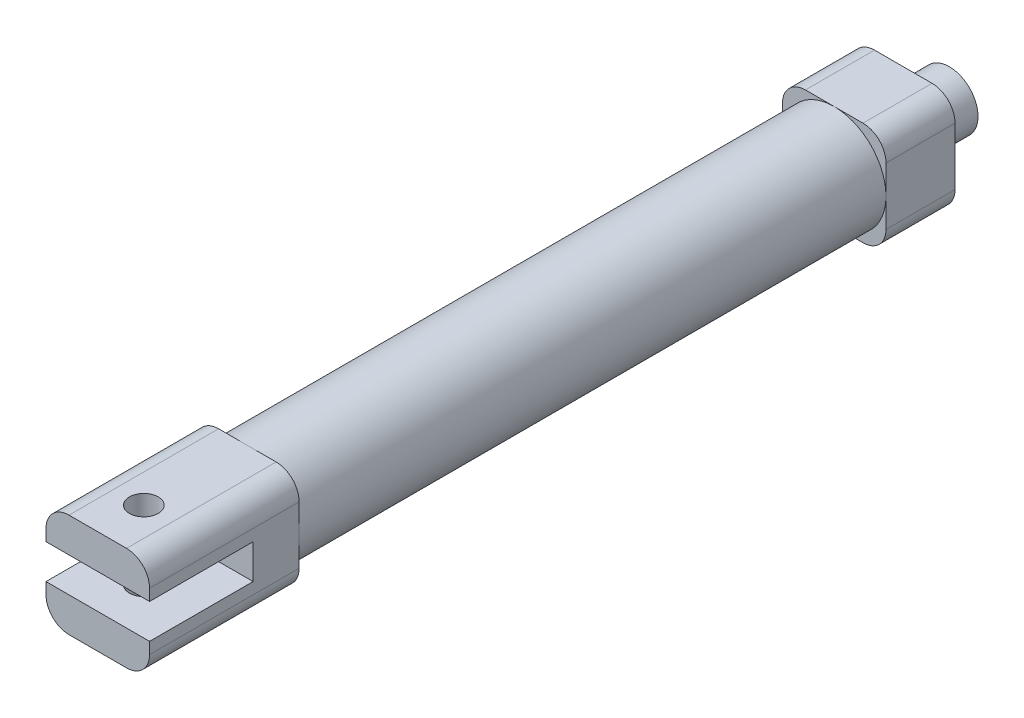
ISO-10303-21;
HEADER;
FILE_DESCRIPTION(('STEP AP214'),'2;1');
FILE_NAME('part.step','',(''),(''),'','','');
FILE_SCHEMA(('AUTOMOTIVE_DESIGN { 1 0 10303 214 1 1 1 1 }'));
ENDSEC;
DATA;
#1=APPLICATION_CONTEXT('core data for automotive mechanical design processes');
#2=APPLICATION_PROTOCOL_DEFINITION('international standard','automotive_design',2000,#1);
#3=PRODUCT_CONTEXT('',#1,'mechanical');
#4=PRODUCT('Part','Part','',(#3));
#5=PRODUCT_RELATED_PRODUCT_CATEGORY('part','',(#4));
#6=PRODUCT_DEFINITION_FORMATION('','',#4);
#7=PRODUCT_DEFINITION_CONTEXT('part definition',#1,'design');
#8=PRODUCT_DEFINITION('design','',#6,#7);
#9=PRODUCT_DEFINITION_SHAPE('','',#8);
#10=(LENGTH_UNIT() NAMED_UNIT(*) SI_UNIT(.MILLI.,.METRE.));
#11=(NAMED_UNIT(*) PLANE_ANGLE_UNIT() SI_UNIT($,.RADIAN.));
#12=(NAMED_UNIT(*) SI_UNIT($,.STERADIAN.) SOLID_ANGLE_UNIT());
#13=UNCERTAINTY_MEASURE_WITH_UNIT(LENGTH_MEASURE(1.E-05),#10,'distance_accuracy_value','');
#14=(GEOMETRIC_REPRESENTATION_CONTEXT(3) GLOBAL_UNCERTAINTY_ASSIGNED_CONTEXT((#13)) GLOBAL_UNIT_ASSIGNED_CONTEXT((#10,
#11,#12)) REPRESENTATION_CONTEXT('',''));
#15=CARTESIAN_POINT('',(0.,0.,0.));
#16=DIRECTION('',(0.,0.,1.));
#17=DIRECTION('',(1.,0.,0.));
#18=AXIS2_PLACEMENT_3D('',#15,#16,#17);
#19=CARTESIAN_POINT('',(-5.,5.,128.));
#20=DIRECTION('',(0.,0.,1.));
#21=DIRECTION('',(1.,0.,0.));
#22=AXIS2_PLACEMENT_3D('',#19,#20,#21);
#23=PLANE('',#22);
#24=DIRECTION('',(1.,0.,0.));
#25=VECTOR('',#24,1.);
#26=CARTESIAN_POINT('',(-5.,-3.,128.));
#27=LINE('',#26,#25);
#28=CARTESIAN_POINT('',(-9.,-3.,128.));
#29=VERTEX_POINT('',#28);
#30=CARTESIAN_POINT('',(9.,-3.,128.));
#31=VERTEX_POINT('',#30);
#32=EDGE_CURVE('E43',#29,#31,#27,.T.);
#33=ORIENTED_EDGE('',*,*,#32,.F.);
#34=DIRECTION('',(0.,-1.,0.));
#35=VECTOR('',#34,1.);
#36=CARTESIAN_POINT('',(-9.,-5.,128.));
#37=LINE('',#36,#35);
#38=CARTESIAN_POINT('',(-9.,-5.,128.));
#39=VERTEX_POINT('',#38);
#40=EDGE_CURVE('E222',#29,#39,#37,.T.);
#41=ORIENTED_EDGE('',*,*,#40,.T.);
#42=CARTESIAN_POINT('',(-5.,-5.,128.));
#43=DIRECTION('',(0.,0.,1.));
#44=DIRECTION('',(1.,0.,0.));
#45=AXIS2_PLACEMENT_3D('',#42,#43,#44);
#46=CIRCLE('',#45,4.);
#47=CARTESIAN_POINT('',(-5.,-9.,128.));
#48=VERTEX_POINT('',#47);
#49=EDGE_CURVE('E221',#39,#48,#46,.T.);
#50=ORIENTED_EDGE('',*,*,#49,.T.);
#51=DIRECTION('',(1.,0.,0.));
#52=VECTOR('',#51,1.);
#53=CARTESIAN_POINT('',(-5.,-9.,128.));
#54=LINE('',#53,#52);
#55=CARTESIAN_POINT('',(5.,-9.,128.));
#56=VERTEX_POINT('',#55);
#57=EDGE_CURVE('E224',#48,#56,#54,.T.);
#58=ORIENTED_EDGE('',*,*,#57,.T.);
#59=CARTESIAN_POINT('',(5.,-5.,128.));
#60=DIRECTION('',(0.,0.,1.));
#61=DIRECTION('',(-1.,0.,0.));
#62=AXIS2_PLACEMENT_3D('',#59,#60,#61);
#63=CIRCLE('',#62,4.);
#64=CARTESIAN_POINT('',(9.,-5.,128.));
#65=VERTEX_POINT('',#64);
#66=EDGE_CURVE('E230',#56,#65,#63,.T.);
#67=ORIENTED_EDGE('',*,*,#66,.T.);
#68=DIRECTION('',(0.,1.,0.));
#69=VECTOR('',#68,1.);
#70=CARTESIAN_POINT('',(9.,-5.,128.));
#71=LINE('',#70,#69);
#72=EDGE_CURVE('E233',#65,#31,#71,.T.);
#73=ORIENTED_EDGE('',*,*,#72,.T.);
#74=EDGE_LOOP('',(#33,#41,#50,#58,#67,#73));
#75=FACE_BOUND('',#74,.T.);
#76=ADVANCED_FACE('F34',(#75),#23,.T.);
#77=CARTESIAN_POINT('',(4.99999999999999,-5.,0.));
#78=DIRECTION('',(0.,0.,-1.));
#79=DIRECTION('',(-1.,0.,0.));
#80=AXIS2_PLACEMENT_3D('',#77,#78,#79);
#81=PLANE('',#80);
#82=CARTESIAN_POINT('',(0.,0.,0.));
#83=DIRECTION('',(0.,0.,-1.));
#84=DIRECTION('',(-1.,0.,0.));
#85=AXIS2_PLACEMENT_3D('',#82,#83,#84);
#86=CIRCLE('',#85,2.5);
#87=CARTESIAN_POINT('',(-2.5,0.,0.));
#88=VERTEX_POINT('',#87);
#89=EDGE_CURVE('E304',#88,#88,#86,.T.);
#90=ORIENTED_EDGE('',*,*,#89,.T.);
#91=EDGE_LOOP('',(#90));
#92=FACE_BOUND('',#91,.T.);
#93=CARTESIAN_POINT('',(0.,0.,0.));
#94=DIRECTION('',(0.,0.,1.));
#95=DIRECTION('',(1.,0.,0.));
#96=AXIS2_PLACEMENT_3D('',#93,#94,#95);
#97=CIRCLE('',#96,8.);
#98=CARTESIAN_POINT('',(8.,0.,0.));
#99=VERTEX_POINT('',#98);
#100=EDGE_CURVE('E292',#99,#99,#97,.T.);
#101=ORIENTED_EDGE('',*,*,#100,.T.);
#102=EDGE_LOOP('',(#101));
#103=FACE_BOUND('',#102,.T.);
#104=ADVANCED_FACE('F479',(#92,#103),#81,.F.);
#105=CARTESIAN_POINT('',(-5.,5.,102.));
#106=DIRECTION('',(0.,0.,1.));
#107=DIRECTION('',(1.,0.,0.));
#108=AXIS2_PLACEMENT_3D('',#105,#106,#107);
#109=PLANE('',#108);
#110=CARTESIAN_POINT('',(0.,0.,102.));
#111=DIRECTION('',(0.,0.,1.));
#112=DIRECTION('',(1.,0.,0.));
#113=AXIS2_PLACEMENT_3D('',#110,#111,#112);
#114=CIRCLE('',#113,8.);
#115=CARTESIAN_POINT('',(8.,0.,102.));
#116=VERTEX_POINT('',#115);
#117=EDGE_CURVE('E289',#116,#116,#114,.T.);
#118=ORIENTED_EDGE('',*,*,#117,.F.);
#119=EDGE_LOOP('',(#118));
#120=FACE_BOUND('',#119,.T.);
#121=ADVANCED_FACE('F488',(#120),#109,.F.);
#122=CARTESIAN_POINT('',(0.,0.,102.));
#123=DIRECTION('',(0.,0.,-1.));
#124=DIRECTION('',(-1.,0.,0.));
#125=AXIS2_PLACEMENT_3D('',#122,#123,#124);
#126=CYLINDRICAL_SURFACE('',#125,8.);
#127=ORIENTED_EDGE('',*,*,#117,.T.);
#128=EDGE_LOOP('',(#127));
#129=FACE_BOUND('',#128,.T.);
#130=ORIENTED_EDGE('',*,*,#100,.F.);
#131=EDGE_LOOP('',(#130));
#132=FACE_BOUND('',#131,.T.);
#133=ADVANCED_FACE('F527',(#129,#132),#126,.F.);
#134=CARTESIAN_POINT('',(0.,0.,18.));
#135=DIRECTION('',(0.,0.,-1.));
#136=DIRECTION('',(-1.,0.,0.));
#137=AXIS2_PLACEMENT_3D('',#134,#135,#136);
#138=CYLINDRICAL_SURFACE('',#137,2.5);
#139=CARTESIAN_POINT('',(0.,0.,-20.));
#140=DIRECTION('',(0.,0.,-1.));
#141=DIRECTION('',(-1.,0.,0.));
#142=AXIS2_PLACEMENT_3D('',#139,#140,#141);
#143=CIRCLE('',#142,2.5);
#144=CARTESIAN_POINT('',(-2.5,0.,-20.));
#145=VERTEX_POINT('',#144);
#146=EDGE_CURVE('E307',#145,#145,#143,.T.);
#147=ORIENTED_EDGE('',*,*,#146,.T.);
#148=EDGE_LOOP('',(#147));
#149=FACE_BOUND('',#148,.T.);
#150=ORIENTED_EDGE('',*,*,#89,.F.);
#151=EDGE_LOOP('',(#150));
#152=FACE_BOUND('',#151,.T.);
#153=ADVANCED_FACE('F529',(#149,#152),#138,.F.);
#154=CARTESIAN_POINT('',(4.99999999999999,-5.,-12.));
#155=DIRECTION('',(0.,0.,-1.));
#156=DIRECTION('',(-1.,0.,0.));
#157=AXIS2_PLACEMENT_3D('',#154,#155,#156);
#158=PLANE('',#157);
#159=CARTESIAN_POINT('',(4.99999999999999,-5.,-12.));
#160=DIRECTION('',(0.,0.,-1.));
#161=DIRECTION('',(-1.,0.,0.));
#162=AXIS2_PLACEMENT_3D('',#159,#160,#161);
#163=CIRCLE('',#162,4.);
#164=CARTESIAN_POINT('',(8.99999999999999,-5.,-12.));
#165=VERTEX_POINT('',#164);
#166=CARTESIAN_POINT('',(4.99999999999999,-9.,-12.));
#167=VERTEX_POINT('',#166);
#168=EDGE_CURVE('E375',#165,#167,#163,.T.);
#169=ORIENTED_EDGE('',*,*,#168,.T.);
#170=DIRECTION('',(-1.,0.,0.));
#171=VECTOR('',#170,1.);
#172=CARTESIAN_POINT('',(4.99999999999999,-9.,-12.));
#173=LINE('',#172,#171);
#174=CARTESIAN_POINT('',(-5.00000000000001,-9.,-12.));
#175=VERTEX_POINT('',#174);
#176=EDGE_CURVE('E378',#167,#175,#173,.T.);
#177=ORIENTED_EDGE('',*,*,#176,.T.);
#178=CARTESIAN_POINT('',(-5.00000000000001,-5.,-12.));
#179=DIRECTION('',(0.,0.,-1.));
#180=DIRECTION('',(-1.,0.,0.));
#181=AXIS2_PLACEMENT_3D('',#178,#179,#180);
#182=CIRCLE('',#181,4.);
#183=CARTESIAN_POINT('',(-9.00000000000001,-5.,-12.));
#184=VERTEX_POINT('',#183);
#185=EDGE_CURVE('E380',#175,#184,#182,.T.);
#186=ORIENTED_EDGE('',*,*,#185,.T.);
#187=DIRECTION('',(0.,1.,0.));
#188=VECTOR('',#187,1.);
#189=CARTESIAN_POINT('',(-9.00000000000001,-5.,-12.));
#190=LINE('',#189,#188);
#191=CARTESIAN_POINT('',(-9.00000000000001,5.,-12.));
#192=VERTEX_POINT('',#191);
#193=EDGE_CURVE('E382',#184,#192,#190,.T.);
#194=ORIENTED_EDGE('',*,*,#193,.T.);
#195=CARTESIAN_POINT('',(-5.00000000000001,5.,-12.));
#196=DIRECTION('',(0.,0.,-1.));
#197=DIRECTION('',(-1.,0.,0.));
#198=AXIS2_PLACEMENT_3D('',#195,#196,#197);
#199=CIRCLE('',#198,4.);
#200=CARTESIAN_POINT('',(-5.00000000000001,9.,-12.));
#201=VERTEX_POINT('',#200);
#202=EDGE_CURVE('E384',#192,#201,#199,.T.);
#203=ORIENTED_EDGE('',*,*,#202,.T.);
#204=DIRECTION('',(1.,0.,0.));
#205=VECTOR('',#204,1.);
#206=CARTESIAN_POINT('',(4.99999999999999,9.,-12.));
#207=LINE('',#206,#205);
#208=CARTESIAN_POINT('',(4.99999999999999,9.,-12.));
#209=VERTEX_POINT('',#208);
#210=EDGE_CURVE('E386',#201,#209,#207,.T.);
#211=ORIENTED_EDGE('',*,*,#210,.T.);
#212=CARTESIAN_POINT('',(4.99999999999999,5.,-12.));
#213=DIRECTION('',(0.,0.,-1.));
#214=DIRECTION('',(-1.,0.,0.));
#215=AXIS2_PLACEMENT_3D('',#212,#213,#214);
#216=CIRCLE('',#215,4.);
#217=CARTESIAN_POINT('',(8.99999999999999,5.,-12.));
#218=VERTEX_POINT('',#217);
#219=EDGE_CURVE('E388',#209,#218,#216,.T.);
#220=ORIENTED_EDGE('',*,*,#219,.T.);
#221=DIRECTION('',(0.,-1.,0.));
#222=VECTOR('',#221,1.);
#223=CARTESIAN_POINT('',(8.99999999999999,-5.,-12.));
#224=LINE('',#223,#222);
#225=EDGE_CURVE('E390',#218,#165,#224,.T.);
#226=ORIENTED_EDGE('',*,*,#225,.T.);
#227=EDGE_LOOP('',(#169,#177,#186,#194,#203,#211,#220,#226));
#228=FACE_BOUND('',#227,.T.);
#229=CARTESIAN_POINT('',(0.,0.,-12.));
#230=DIRECTION('',(0.,0.,-1.));
#231=DIRECTION('',(-1.,0.,0.));
#232=AXIS2_PLACEMENT_3D('',#229,#230,#231);
#233=CIRCLE('',#232,5.);
#234=CARTESIAN_POINT('',(-5.,0.,-12.));
#235=VERTEX_POINT('',#234);
#236=EDGE_CURVE('E306',#235,#235,#233,.T.);
#237=ORIENTED_EDGE('',*,*,#236,.F.);
#238=EDGE_LOOP('',(#237));
#239=FACE_BOUND('',#238,.T.);
#240=ADVANCED_FACE('F462',(#228,#239),#158,.T.);
#241=CARTESIAN_POINT('',(0.,0.,102.));
#242=DIRECTION('',(0.,0.,-1.));
#243=DIRECTION('',(-1.,0.,0.));
#244=AXIS2_PLACEMENT_3D('',#241,#242,#243);
#245=CYLINDRICAL_SURFACE('',#244,9.);
#246=CARTESIAN_POINT('',(0.,0.,102.));
#247=DIRECTION('',(0.,0.,1.));
#248=DIRECTION('',(1.,0.,0.));
#249=AXIS2_PLACEMENT_3D('',#246,#247,#248);
#250=CIRCLE('',#249,9.);
#251=CARTESIAN_POINT('',(9.,0.,102.));
#252=VERTEX_POINT('',#251);
#253=CARTESIAN_POINT('',(0.,9.,102.));
#254=VERTEX_POINT('',#253);
#255=EDGE_CURVE('E204',#252,#254,#250,.T.);
#256=ORIENTED_EDGE('',*,*,#255,.F.);
#257=CARTESIAN_POINT('',(0.,-9.,102.));
#258=VERTEX_POINT('',#257);
#259=EDGE_CURVE('E299',#258,#252,#250,.T.);
#260=ORIENTED_EDGE('',*,*,#259,.F.);
#261=CARTESIAN_POINT('',(-9.,0.,102.));
#262=VERTEX_POINT('',#261);
#263=EDGE_CURVE('E337',#262,#258,#250,.T.);
#264=ORIENTED_EDGE('',*,*,#263,.F.);
#265=EDGE_CURVE('E298',#254,#262,#250,.T.);
#266=ORIENTED_EDGE('',*,*,#265,.F.);
#267=EDGE_LOOP('',(#256,#260,#264,#266));
#268=FACE_BOUND('',#267,.T.);
#269=CARTESIAN_POINT('',(0.,0.,0.));
#270=DIRECTION('',(0.,0.,1.));
#271=DIRECTION('',(1.,0.,0.));
#272=AXIS2_PLACEMENT_3D('',#269,#270,#271);
#273=CIRCLE('',#272,9.);
#274=CARTESIAN_POINT('',(8.99999999999999,0.,0.));
#275=VERTEX_POINT('',#274);
#276=CARTESIAN_POINT('',(0.,9.,0.));
#277=VERTEX_POINT('',#276);
#278=EDGE_CURVE('E300',#275,#277,#273,.T.);
#279=ORIENTED_EDGE('',*,*,#278,.T.);
#280=CARTESIAN_POINT('',(-9.00000000000001,0.,0.));
#281=VERTEX_POINT('',#280);
#282=EDGE_CURVE('E303',#277,#281,#273,.T.);
#283=ORIENTED_EDGE('',*,*,#282,.T.);
#284=CARTESIAN_POINT('',(0.,-9.,0.));
#285=VERTEX_POINT('',#284);
#286=EDGE_CURVE('E450',#281,#285,#273,.T.);
#287=ORIENTED_EDGE('',*,*,#286,.T.);
#288=EDGE_CURVE('E295',#285,#275,#273,.T.);
#289=ORIENTED_EDGE('',*,*,#288,.T.);
#290=EDGE_LOOP('',(#279,#283,#287,#289));
#291=FACE_BOUND('',#290,.T.);
#292=ADVANCED_FACE('F36',(#268,#291),#245,.T.);
#293=DIRECTION('',(0.,1.,0.));
#294=VECTOR('',#293,1.);
#295=CARTESIAN_POINT('',(9.,-5.,102.));
#296=LINE('',#295,#294);
#297=CARTESIAN_POINT('',(9.,5.,102.));
#298=VERTEX_POINT('',#297);
#299=EDGE_CURVE('E257',#252,#298,#296,.T.);
#300=ORIENTED_EDGE('',*,*,#299,.F.);
#301=ORIENTED_EDGE('',*,*,#255,.T.);
#302=DIRECTION('',(-1.,0.,0.));
#303=VECTOR('',#302,1.);
#304=CARTESIAN_POINT('',(-5.,9.,102.));
#305=LINE('',#304,#303);
#306=CARTESIAN_POINT('',(5.,9.,102.));
#307=VERTEX_POINT('',#306);
#308=EDGE_CURVE('E264',#307,#254,#305,.T.);
#309=ORIENTED_EDGE('',*,*,#308,.F.);
#310=CARTESIAN_POINT('',(5.,5.,102.));
#311=DIRECTION('',(0.,0.,1.));
#312=DIRECTION('',(1.,0.,0.));
#313=AXIS2_PLACEMENT_3D('',#310,#311,#312);
#314=CIRCLE('',#313,4.);
#315=EDGE_CURVE('E261',#298,#307,#314,.T.);
#316=ORIENTED_EDGE('',*,*,#315,.F.);
#317=EDGE_LOOP('',(#300,#301,#309,#316));
#318=FACE_BOUND('',#317,.T.);
#319=ADVANCED_FACE('F340',(#318),#109,.F.);
#320=CARTESIAN_POINT('',(-5.,9.,102.));
#321=VERTEX_POINT('',#320);
#322=EDGE_CURVE('E263',#254,#321,#305,.T.);
#323=ORIENTED_EDGE('',*,*,#322,.F.);
#324=ORIENTED_EDGE('',*,*,#265,.T.);
#325=DIRECTION('',(0.,-1.,0.));
#326=VECTOR('',#325,1.);
#327=CARTESIAN_POINT('',(-9.,-5.,102.));
#328=LINE('',#327,#326);
#329=CARTESIAN_POINT('',(-9.,5.,102.));
#330=VERTEX_POINT('',#329);
#331=EDGE_CURVE('E246',#330,#262,#328,.T.);
#332=ORIENTED_EDGE('',*,*,#331,.F.);
#333=CARTESIAN_POINT('',(-5.,5.,102.));
#334=DIRECTION('',(0.,0.,1.));
#335=DIRECTION('',(1.,0.,0.));
#336=AXIS2_PLACEMENT_3D('',#333,#334,#335);
#337=CIRCLE('',#336,4.);
#338=EDGE_CURVE('E241',#321,#330,#337,.T.);
#339=ORIENTED_EDGE('',*,*,#338,.F.);
#340=EDGE_LOOP('',(#323,#324,#332,#339));
#341=FACE_BOUND('',#340,.T.);
#342=ADVANCED_FACE('F545',(#341),#109,.F.);
#343=CARTESIAN_POINT('',(-9.,-5.,102.));
#344=VERTEX_POINT('',#343);
#345=EDGE_CURVE('E244',#262,#344,#328,.T.);
#346=ORIENTED_EDGE('',*,*,#345,.F.);
#347=ORIENTED_EDGE('',*,*,#263,.T.);
#348=DIRECTION('',(1.,0.,0.));
#349=VECTOR('',#348,1.);
#350=CARTESIAN_POINT('',(-5.,-9.,102.));
#351=LINE('',#350,#349);
#352=CARTESIAN_POINT('',(-5.,-9.,102.));
#353=VERTEX_POINT('',#352);
#354=EDGE_CURVE('E252',#353,#258,#351,.T.);
#355=ORIENTED_EDGE('',*,*,#354,.F.);
#356=CARTESIAN_POINT('',(-5.,-5.,102.));
#357=DIRECTION('',(0.,0.,1.));
#358=DIRECTION('',(1.,0.,0.));
#359=AXIS2_PLACEMENT_3D('',#356,#357,#358);
#360=CIRCLE('',#359,4.);
#361=EDGE_CURVE('E249',#344,#353,#360,.T.);
#362=ORIENTED_EDGE('',*,*,#361,.F.);
#363=EDGE_LOOP('',(#346,#347,#355,#362));
#364=FACE_BOUND('',#363,.T.);
#365=ADVANCED_FACE('F547',(#364),#109,.F.);
#366=CARTESIAN_POINT('',(5.,-9.,102.));
#367=VERTEX_POINT('',#366);
#368=EDGE_CURVE('E251',#258,#367,#351,.T.);
#369=ORIENTED_EDGE('',*,*,#368,.F.);
#370=ORIENTED_EDGE('',*,*,#259,.T.);
#371=CARTESIAN_POINT('',(9.,-5.,102.));
#372=VERTEX_POINT('',#371);
#373=EDGE_CURVE('E258',#372,#252,#296,.T.);
#374=ORIENTED_EDGE('',*,*,#373,.F.);
#375=CARTESIAN_POINT('',(5.,-5.,102.));
#376=DIRECTION('',(0.,0.,1.));
#377=DIRECTION('',(-1.,0.,0.));
#378=AXIS2_PLACEMENT_3D('',#375,#376,#377);
#379=CIRCLE('',#378,4.);
#380=EDGE_CURVE('E255',#367,#372,#379,.T.);
#381=ORIENTED_EDGE('',*,*,#380,.F.);
#382=EDGE_LOOP('',(#369,#370,#374,#381));
#383=FACE_BOUND('',#382,.T.);
#384=ADVANCED_FACE('F333',(#383),#109,.F.);
#385=CARTESIAN_POINT('',(-5.,5.,128.));
#386=DIRECTION('',(0.,0.,-1.));
#387=DIRECTION('',(-1.,0.,0.));
#388=AXIS2_PLACEMENT_3D('',#385,#386,#387);
#389=CYLINDRICAL_SURFACE('',#388,4.);
#390=ORIENTED_EDGE('',*,*,#338,.T.);
#391=DIRECTION('',(0.,0.,-1.));
#392=VECTOR('',#391,1.);
#393=CARTESIAN_POINT('',(-9.,5.,128.));
#394=LINE('',#393,#392);
#395=CARTESIAN_POINT('',(-9.,5.,128.));
#396=VERTEX_POINT('',#395);
#397=EDGE_CURVE('E287',#396,#330,#394,.T.);
#398=ORIENTED_EDGE('',*,*,#397,.F.);
#399=CARTESIAN_POINT('',(-5.,5.,128.));
#400=DIRECTION('',(0.,0.,1.));
#401=DIRECTION('',(1.,0.,0.));
#402=AXIS2_PLACEMENT_3D('',#399,#400,#401);
#403=CIRCLE('',#402,4.);
#404=CARTESIAN_POINT('',(-5.,9.,128.));
#405=VERTEX_POINT('',#404);
#406=EDGE_CURVE('E219',#405,#396,#403,.T.);
#407=ORIENTED_EDGE('',*,*,#406,.F.);
#408=DIRECTION('',(0.,0.,-1.));
#409=VECTOR('',#408,1.);
#410=CARTESIAN_POINT('',(-5.,9.,128.));
#411=LINE('',#410,#409);
#412=EDGE_CURVE('E240',#405,#321,#411,.T.);
#413=ORIENTED_EDGE('',*,*,#412,.T.);
#414=EDGE_LOOP('',(#390,#398,#407,#413));
#415=FACE_BOUND('',#414,.T.);
#416=ADVANCED_FACE('F523',(#415),#389,.T.);
#417=CARTESIAN_POINT('',(-9.,-5.,128.));
#418=DIRECTION('',(1.,0.,0.));
#419=DIRECTION('',(0.,0.,-1.));
#420=AXIS2_PLACEMENT_3D('',#417,#418,#419);
#421=PLANE('',#420);
#422=CARTESIAN_POINT('',(-9.00000000000001,0.,106.));
#423=DIRECTION('',(-1.,0.,0.));
#424=DIRECTION('',(0.,0.,1.));
#425=AXIS2_PLACEMENT_3D('',#422,#423,#424);
#426=CIRCLE('',#425,1.98051649837292);
#427=CARTESIAN_POINT('',(-9.00000000000001,0.,107.980516498373));
#428=VERTEX_POINT('',#427);
#429=EDGE_CURVE('E320',#428,#428,#426,.T.);
#430=ORIENTED_EDGE('',*,*,#429,.F.);
#431=EDGE_LOOP('',(#430));
#432=FACE_BOUND('',#431,.T.);
#433=ORIENTED_EDGE('',*,*,#40,.F.);
#434=DIRECTION('',(0.,0.,1.));
#435=VECTOR('',#434,1.);
#436=CARTESIAN_POINT('',(-9.,-3.,128.));
#437=LINE('',#436,#435);
#438=CARTESIAN_POINT('',(-9.,-3.00000000000001,110.));
#439=VERTEX_POINT('',#438);
#440=EDGE_CURVE('E315',#439,#29,#437,.T.);
#441=ORIENTED_EDGE('',*,*,#440,.F.);
#442=DIRECTION('',(0.,-1.,0.));
#443=VECTOR('',#442,1.);
#444=CARTESIAN_POINT('',(-9.,2.99999999999999,110.));
#445=LINE('',#444,#443);
#446=CARTESIAN_POINT('',(-9.,2.99999999999999,110.));
#447=VERTEX_POINT('',#446);
#448=EDGE_CURVE('E214',#447,#439,#445,.T.);
#449=ORIENTED_EDGE('',*,*,#448,.F.);
#450=DIRECTION('',(0.,0.,-1.));
#451=VECTOR('',#450,1.);
#452=CARTESIAN_POINT('',(-9.,3.,128.));
#453=LINE('',#452,#451);
#454=CARTESIAN_POINT('',(-9.,3.,128.));
#455=VERTEX_POINT('',#454);
#456=EDGE_CURVE('E199',#455,#447,#453,.T.);
#457=ORIENTED_EDGE('',*,*,#456,.F.);
#458=EDGE_CURVE('E210',#396,#455,#37,.T.);
#459=ORIENTED_EDGE('',*,*,#458,.F.);
#460=ORIENTED_EDGE('',*,*,#397,.T.);
#461=ORIENTED_EDGE('',*,*,#331,.T.);
#462=ORIENTED_EDGE('',*,*,#345,.T.);
#463=DIRECTION('',(0.,0.,-1.));
#464=VECTOR('',#463,1.);
#465=CARTESIAN_POINT('',(-9.,-5.,128.));
#466=LINE('',#465,#464);
#467=EDGE_CURVE('E284',#39,#344,#466,.T.);
#468=ORIENTED_EDGE('',*,*,#467,.F.);
#469=EDGE_LOOP('',(#433,#441,#449,#457,#459,#460,#461,#462,#468));
#470=FACE_BOUND('',#469,.T.);
#471=ADVANCED_FACE('F208',(#432,#470),#421,.F.);
#472=CARTESIAN_POINT('',(-5.,-5.,128.));
#473=DIRECTION('',(0.,0.,-1.));
#474=DIRECTION('',(-1.,0.,0.));
#475=AXIS2_PLACEMENT_3D('',#472,#473,#474);
#476=CYLINDRICAL_SURFACE('',#475,4.);
#477=ORIENTED_EDGE('',*,*,#361,.T.);
#478=DIRECTION('',(0.,0.,-1.));
#479=VECTOR('',#478,1.);
#480=CARTESIAN_POINT('',(-5.,-9.,128.));
#481=LINE('',#480,#479);
#482=EDGE_CURVE('E281',#48,#353,#481,.T.);
#483=ORIENTED_EDGE('',*,*,#482,.F.);
#484=ORIENTED_EDGE('',*,*,#49,.F.);
#485=ORIENTED_EDGE('',*,*,#467,.T.);
#486=EDGE_LOOP('',(#477,#483,#484,#485));
#487=FACE_BOUND('',#486,.T.);
#488=ADVANCED_FACE('F516',(#487),#476,.T.);
#489=CARTESIAN_POINT('',(-5.,-9.,128.));
#490=DIRECTION('',(0.,1.,0.));
#491=DIRECTION('',(0.,0.,1.));
#492=AXIS2_PLACEMENT_3D('',#489,#490,#491);
#493=PLANE('',#492);
#494=CARTESIAN_POINT('',(0.,-9.,120.));
#495=DIRECTION('',(0.,-1.,0.));
#496=DIRECTION('',(0.,0.,-1.));
#497=AXIS2_PLACEMENT_3D('',#494,#495,#496);
#498=CIRCLE('',#497,2.5);
#499=CARTESIAN_POINT('',(0.,-9.,117.5));
#500=VERTEX_POINT('',#499);
#501=EDGE_CURVE('E656',#500,#500,#498,.T.);
#502=ORIENTED_EDGE('',*,*,#501,.F.);
#503=EDGE_LOOP('',(#502));
#504=FACE_BOUND('',#503,.T.);
#505=ORIENTED_EDGE('',*,*,#354,.T.);
#506=ORIENTED_EDGE('',*,*,#368,.T.);
#507=DIRECTION('',(0.,0.,-1.));
#508=VECTOR('',#507,1.);
#509=CARTESIAN_POINT('',(5.,-9.,128.));
#510=LINE('',#509,#508);
#511=EDGE_CURVE('E278',#56,#367,#510,.T.);
#512=ORIENTED_EDGE('',*,*,#511,.F.);
#513=ORIENTED_EDGE('',*,*,#57,.F.);
#514=ORIENTED_EDGE('',*,*,#482,.T.);
#515=EDGE_LOOP('',(#505,#506,#512,#513,#514));
#516=FACE_BOUND('',#515,.T.);
#517=ADVANCED_FACE('F513',(#504,#516),#493,.F.);
#518=CARTESIAN_POINT('',(5.,-5.,128.));
#519=DIRECTION('',(0.,0.,-1.));
#520=DIRECTION('',(-1.,0.,0.));
#521=AXIS2_PLACEMENT_3D('',#518,#519,#520);
#522=CYLINDRICAL_SURFACE('',#521,4.);
#523=ORIENTED_EDGE('',*,*,#380,.T.);
#524=DIRECTION('',(0.,0.,-1.));
#525=VECTOR('',#524,1.);
#526=CARTESIAN_POINT('',(9.,-5.,128.));
#527=LINE('',#526,#525);
#528=EDGE_CURVE('E275',#65,#372,#527,.T.);
#529=ORIENTED_EDGE('',*,*,#528,.F.);
#530=ORIENTED_EDGE('',*,*,#66,.F.);
#531=ORIENTED_EDGE('',*,*,#511,.T.);
#532=EDGE_LOOP('',(#523,#529,#530,#531));
#533=FACE_BOUND('',#532,.T.);
#534=ADVANCED_FACE('F327',(#533),#522,.T.);
#535=CARTESIAN_POINT('',(9.,-5.,128.));
#536=DIRECTION('',(-1.,0.,0.));
#537=DIRECTION('',(0.,-1.,0.));
#538=AXIS2_PLACEMENT_3D('',#535,#536,#537);
#539=PLANE('',#538);
#540=DIRECTION('',(0.,-1.,0.));
#541=VECTOR('',#540,1.);
#542=CARTESIAN_POINT('',(9.,-5.,110.));
#543=LINE('',#542,#541);
#544=CARTESIAN_POINT('',(9.,2.99999999999999,110.));
#545=VERTEX_POINT('',#544);
#546=CARTESIAN_POINT('',(9.,-3.00000000000001,110.));
#547=VERTEX_POINT('',#546);
#548=EDGE_CURVE('E12',#545,#547,#543,.T.);
#549=ORIENTED_EDGE('',*,*,#548,.T.);
#550=DIRECTION('',(0.,0.,1.));
#551=VECTOR('',#550,1.);
#552=CARTESIAN_POINT('',(9.,-3.,128.));
#553=LINE('',#552,#551);
#554=EDGE_CURVE('E313',#547,#31,#553,.T.);
#555=ORIENTED_EDGE('',*,*,#554,.T.);
#556=ORIENTED_EDGE('',*,*,#72,.F.);
#557=ORIENTED_EDGE('',*,*,#528,.T.);
#558=ORIENTED_EDGE('',*,*,#373,.T.);
#559=ORIENTED_EDGE('',*,*,#299,.T.);
#560=DIRECTION('',(0.,0.,-1.));
#561=VECTOR('',#560,1.);
#562=CARTESIAN_POINT('',(9.,5.,128.));
#563=LINE('',#562,#561);
#564=CARTESIAN_POINT('',(9.,5.,128.));
#565=VERTEX_POINT('',#564);
#566=EDGE_CURVE('E272',#565,#298,#563,.T.);
#567=ORIENTED_EDGE('',*,*,#566,.F.);
#568=CARTESIAN_POINT('',(9.,3.,128.));
#569=VERTEX_POINT('',#568);
#570=EDGE_CURVE('E232',#569,#565,#71,.T.);
#571=ORIENTED_EDGE('',*,*,#570,.F.);
#572=DIRECTION('',(0.,0.,-1.));
#573=VECTOR('',#572,1.);
#574=CARTESIAN_POINT('',(9.,3.,128.));
#575=LINE('',#574,#573);
#576=EDGE_CURVE('E50',#569,#545,#575,.T.);
#577=ORIENTED_EDGE('',*,*,#576,.T.);
#578=EDGE_LOOP('',(#549,#555,#556,#557,#558,#559,#567,#571,#577));
#579=FACE_BOUND('',#578,.T.);
#580=ADVANCED_FACE('F319',(#579),#539,.F.);
#581=CARTESIAN_POINT('',(5.,5.,128.));
#582=DIRECTION('',(0.,0.,-1.));
#583=DIRECTION('',(-1.,0.,0.));
#584=AXIS2_PLACEMENT_3D('',#581,#582,#583);
#585=CYLINDRICAL_SURFACE('',#584,4.);
#586=ORIENTED_EDGE('',*,*,#315,.T.);
#587=DIRECTION('',(0.,0.,-1.));
#588=VECTOR('',#587,1.);
#589=CARTESIAN_POINT('',(5.,9.,128.));
#590=LINE('',#589,#588);
#591=CARTESIAN_POINT('',(5.,9.,128.));
#592=VERTEX_POINT('',#591);
#593=EDGE_CURVE('E269',#592,#307,#590,.T.);
#594=ORIENTED_EDGE('',*,*,#593,.F.);
#595=CARTESIAN_POINT('',(5.,5.,128.));
#596=DIRECTION('',(0.,0.,1.));
#597=DIRECTION('',(1.,0.,0.));
#598=AXIS2_PLACEMENT_3D('',#595,#596,#597);
#599=CIRCLE('',#598,4.);
#600=EDGE_CURVE('E236',#565,#592,#599,.T.);
#601=ORIENTED_EDGE('',*,*,#600,.F.);
#602=ORIENTED_EDGE('',*,*,#566,.T.);
#603=EDGE_LOOP('',(#586,#594,#601,#602));
#604=FACE_BOUND('',#603,.T.);
#605=ADVANCED_FACE('F346',(#604),#585,.T.);
#606=CARTESIAN_POINT('',(-5.,9.,128.));
#607=DIRECTION('',(0.,-1.,0.));
#608=DIRECTION('',(0.,0.,-1.));
#609=AXIS2_PLACEMENT_3D('',#606,#607,#608);
#610=PLANE('',#609);
#611=CARTESIAN_POINT('',(0.,9.,120.));
#612=DIRECTION('',(0.,-1.,0.));
#613=DIRECTION('',(0.,0.,-1.));
#614=AXIS2_PLACEMENT_3D('',#611,#612,#613);
#615=CIRCLE('',#614,2.5);
#616=CARTESIAN_POINT('',(0.,9.,117.5));
#617=VERTEX_POINT('',#616);
#618=EDGE_CURVE('E215',#617,#617,#615,.T.);
#619=ORIENTED_EDGE('',*,*,#618,.T.);
#620=EDGE_LOOP('',(#619));
#621=FACE_BOUND('',#620,.T.);
#622=ORIENTED_EDGE('',*,*,#308,.T.);
#623=ORIENTED_EDGE('',*,*,#322,.T.);
#624=ORIENTED_EDGE('',*,*,#412,.F.);
#625=DIRECTION('',(-1.,0.,0.));
#626=VECTOR('',#625,1.);
#627=CARTESIAN_POINT('',(-5.,9.,128.));
#628=LINE('',#627,#626);
#629=EDGE_CURVE('E238',#592,#405,#628,.T.);
#630=ORIENTED_EDGE('',*,*,#629,.F.);
#631=ORIENTED_EDGE('',*,*,#593,.T.);
#632=EDGE_LOOP('',(#622,#623,#624,#630,#631));
#633=FACE_BOUND('',#632,.T.);
#634=ADVANCED_FACE('F493',(#621,#633),#610,.F.);
#635=DIRECTION('',(-1.,0.,0.));
#636=VECTOR('',#635,1.);
#637=CARTESIAN_POINT('',(-5.,3.,128.));
#638=LINE('',#637,#636);
#639=EDGE_CURVE('E196',#569,#455,#638,.T.);
#640=ORIENTED_EDGE('',*,*,#639,.F.);
#641=ORIENTED_EDGE('',*,*,#570,.T.);
#642=ORIENTED_EDGE('',*,*,#600,.T.);
#643=ORIENTED_EDGE('',*,*,#629,.T.);
#644=ORIENTED_EDGE('',*,*,#406,.T.);
#645=ORIENTED_EDGE('',*,*,#458,.T.);
#646=EDGE_LOOP('',(#640,#641,#642,#643,#644,#645));
#647=FACE_BOUND('',#646,.T.);
#648=ADVANCED_FACE('F217',(#647),#23,.T.);
#649=ORIENTED_EDGE('',*,*,#278,.F.);
#650=DIRECTION('',(0.,-1.,0.));
#651=VECTOR('',#650,1.);
#652=CARTESIAN_POINT('',(8.99999999999999,-5.,0.));
#653=LINE('',#652,#651);
#654=CARTESIAN_POINT('',(8.99999999999999,5.,0.));
#655=VERTEX_POINT('',#654);
#656=EDGE_CURVE('E58',#655,#275,#653,.T.);
#657=ORIENTED_EDGE('',*,*,#656,.F.);
#658=CARTESIAN_POINT('',(4.99999999999999,5.,0.));
#659=DIRECTION('',(0.,0.,-1.));
#660=DIRECTION('',(-1.,0.,0.));
#661=AXIS2_PLACEMENT_3D('',#658,#659,#660);
#662=CIRCLE('',#661,4.);
#663=CARTESIAN_POINT('',(4.99999999999999,9.,0.));
#664=VERTEX_POINT('',#663);
#665=EDGE_CURVE('E411',#664,#655,#662,.T.);
#666=ORIENTED_EDGE('',*,*,#665,.F.);
#667=DIRECTION('',(1.,0.,0.));
#668=VECTOR('',#667,1.);
#669=CARTESIAN_POINT('',(4.99999999999999,9.,0.));
#670=LINE('',#669,#668);
#671=EDGE_CURVE('E407',#277,#664,#670,.T.);
#672=ORIENTED_EDGE('',*,*,#671,.F.);
#673=EDGE_LOOP('',(#649,#657,#666,#672));
#674=FACE_BOUND('',#673,.T.);
#675=ADVANCED_FACE('F478',(#674),#81,.F.);
#676=ORIENTED_EDGE('',*,*,#282,.F.);
#677=CARTESIAN_POINT('',(-5.00000000000001,9.,0.));
#678=VERTEX_POINT('',#677);
#679=EDGE_CURVE('E408',#678,#277,#670,.T.);
#680=ORIENTED_EDGE('',*,*,#679,.F.);
#681=CARTESIAN_POINT('',(-5.00000000000001,5.,0.));
#682=DIRECTION('',(0.,0.,-1.));
#683=DIRECTION('',(-1.,0.,0.));
#684=AXIS2_PLACEMENT_3D('',#681,#682,#683);
#685=CIRCLE('',#684,4.);
#686=CARTESIAN_POINT('',(-9.00000000000001,5.,0.));
#687=VERTEX_POINT('',#686);
#688=EDGE_CURVE('E405',#687,#678,#685,.T.);
#689=ORIENTED_EDGE('',*,*,#688,.F.);
#690=DIRECTION('',(0.,1.,0.));
#691=VECTOR('',#690,1.);
#692=CARTESIAN_POINT('',(-9.00000000000001,-5.,0.));
#693=LINE('',#692,#691);
#694=EDGE_CURVE('E401',#281,#687,#693,.T.);
#695=ORIENTED_EDGE('',*,*,#694,.F.);
#696=EDGE_LOOP('',(#676,#680,#689,#695));
#697=FACE_BOUND('',#696,.T.);
#698=ADVANCED_FACE('F498',(#697),#81,.F.);
#699=ORIENTED_EDGE('',*,*,#286,.F.);
#700=CARTESIAN_POINT('',(-9.00000000000001,-5.,0.));
#701=VERTEX_POINT('',#700);
#702=EDGE_CURVE('E402',#701,#281,#693,.T.);
#703=ORIENTED_EDGE('',*,*,#702,.F.);
#704=CARTESIAN_POINT('',(-5.00000000000001,-5.,0.));
#705=DIRECTION('',(0.,0.,-1.));
#706=DIRECTION('',(-1.,0.,0.));
#707=AXIS2_PLACEMENT_3D('',#704,#705,#706);
#708=CIRCLE('',#707,4.);
#709=CARTESIAN_POINT('',(-5.00000000000001,-9.,0.));
#710=VERTEX_POINT('',#709);
#711=EDGE_CURVE('E399',#710,#701,#708,.T.);
#712=ORIENTED_EDGE('',*,*,#711,.F.);
#713=DIRECTION('',(-1.,0.,0.));
#714=VECTOR('',#713,1.);
#715=CARTESIAN_POINT('',(4.99999999999999,-9.,0.));
#716=LINE('',#715,#714);
#717=EDGE_CURVE('E395',#285,#710,#716,.T.);
#718=ORIENTED_EDGE('',*,*,#717,.F.);
#719=EDGE_LOOP('',(#699,#703,#712,#718));
#720=FACE_BOUND('',#719,.T.);
#721=ADVANCED_FACE('F453',(#720),#81,.F.);
#722=CARTESIAN_POINT('',(4.99999999999999,-5.,-12.));
#723=DIRECTION('',(0.,0.,1.));
#724=DIRECTION('',(1.,0.,0.));
#725=AXIS2_PLACEMENT_3D('',#722,#723,#724);
#726=CYLINDRICAL_SURFACE('',#725,4.);
#727=CARTESIAN_POINT('',(4.99999999999999,-5.,0.));
#728=DIRECTION('',(0.,0.,-1.));
#729=DIRECTION('',(-1.,0.,0.));
#730=AXIS2_PLACEMENT_3D('',#727,#728,#729);
#731=CIRCLE('',#730,4.);
#732=CARTESIAN_POINT('',(8.99999999999999,-5.,0.));
#733=VERTEX_POINT('',#732);
#734=CARTESIAN_POINT('',(4.99999999999999,-9.,0.));
#735=VERTEX_POINT('',#734);
#736=EDGE_CURVE('E372',#733,#735,#731,.T.);
#737=ORIENTED_EDGE('',*,*,#736,.T.);
#738=DIRECTION('',(0.,0.,1.));
#739=VECTOR('',#738,1.);
#740=CARTESIAN_POINT('',(4.99999999999999,-9.,-12.));
#741=LINE('',#740,#739);
#742=EDGE_CURVE('E245',#167,#735,#741,.T.);
#743=ORIENTED_EDGE('',*,*,#742,.F.);
#744=ORIENTED_EDGE('',*,*,#168,.F.);
#745=DIRECTION('',(0.,0.,1.));
#746=VECTOR('',#745,1.);
#747=CARTESIAN_POINT('',(8.99999999999999,-5.,-12.));
#748=LINE('',#747,#746);
#749=EDGE_CURVE('E392',#165,#733,#748,.T.);
#750=ORIENTED_EDGE('',*,*,#749,.T.);
#751=EDGE_LOOP('',(#737,#743,#744,#750));
#752=FACE_BOUND('',#751,.T.);
#753=ADVANCED_FACE('F442',(#752),#726,.T.);
#754=CARTESIAN_POINT('',(4.99999999999999,-9.,-12.));
#755=DIRECTION('',(0.,1.,0.));
#756=DIRECTION('',(0.,0.,1.));
#757=AXIS2_PLACEMENT_3D('',#754,#755,#756);
#758=PLANE('',#757);
#759=EDGE_CURVE('E396',#735,#285,#716,.T.);
#760=ORIENTED_EDGE('',*,*,#759,.T.);
#761=ORIENTED_EDGE('',*,*,#717,.T.);
#762=DIRECTION('',(0.,0.,1.));
#763=VECTOR('',#762,1.);
#764=CARTESIAN_POINT('',(-5.00000000000001,-9.,-12.));
#765=LINE('',#764,#763);
#766=EDGE_CURVE('E431',#175,#710,#765,.T.);
#767=ORIENTED_EDGE('',*,*,#766,.F.);
#768=ORIENTED_EDGE('',*,*,#176,.F.);
#769=ORIENTED_EDGE('',*,*,#742,.T.);
#770=EDGE_LOOP('',(#760,#761,#767,#768,#769));
#771=FACE_BOUND('',#770,.T.);
#772=ADVANCED_FACE('F436',(#771),#758,.F.);
#773=CARTESIAN_POINT('',(-5.00000000000001,-5.,-12.));
#774=DIRECTION('',(0.,0.,1.));
#775=DIRECTION('',(1.,0.,0.));
#776=AXIS2_PLACEMENT_3D('',#773,#774,#775);
#777=CYLINDRICAL_SURFACE('',#776,4.);
#778=ORIENTED_EDGE('',*,*,#711,.T.);
#779=DIRECTION('',(0.,0.,1.));
#780=VECTOR('',#779,1.);
#781=CARTESIAN_POINT('',(-9.00000000000001,-5.,-12.));
#782=LINE('',#781,#780);
#783=EDGE_CURVE('E428',#184,#701,#782,.T.);
#784=ORIENTED_EDGE('',*,*,#783,.F.);
#785=ORIENTED_EDGE('',*,*,#185,.F.);
#786=ORIENTED_EDGE('',*,*,#766,.T.);
#787=EDGE_LOOP('',(#778,#784,#785,#786));
#788=FACE_BOUND('',#787,.T.);
#789=ADVANCED_FACE('F458',(#788),#777,.T.);
#790=CARTESIAN_POINT('',(-9.00000000000001,-5.,-12.));
#791=DIRECTION('',(1.,0.,0.));
#792=DIRECTION('',(0.,0.,-1.));
#793=AXIS2_PLACEMENT_3D('',#790,#791,#792);
#794=PLANE('',#793);
#795=CARTESIAN_POINT('',(-9.00000000000001,0.,-4.));
#796=DIRECTION('',(-1.,0.,0.));
#797=DIRECTION('',(0.,0.,1.));
#798=AXIS2_PLACEMENT_3D('',#795,#796,#797);
#799=CIRCLE('',#798,2.);
#800=CARTESIAN_POINT('',(-9.00000000000001,0.,-2.));
#801=VERTEX_POINT('',#800);
#802=EDGE_CURVE('E359',#801,#801,#799,.T.);
#803=ORIENTED_EDGE('',*,*,#802,.F.);
#804=EDGE_LOOP('',(#803));
#805=FACE_BOUND('',#804,.T.);
#806=ORIENTED_EDGE('',*,*,#702,.T.);
#807=ORIENTED_EDGE('',*,*,#694,.T.);
#808=DIRECTION('',(0.,0.,1.));
#809=VECTOR('',#808,1.);
#810=CARTESIAN_POINT('',(-9.00000000000001,5.,-12.));
#811=LINE('',#810,#809);
#812=EDGE_CURVE('E425',#192,#687,#811,.T.);
#813=ORIENTED_EDGE('',*,*,#812,.F.);
#814=ORIENTED_EDGE('',*,*,#193,.F.);
#815=ORIENTED_EDGE('',*,*,#783,.T.);
#816=EDGE_LOOP('',(#806,#807,#813,#814,#815));
#817=FACE_BOUND('',#816,.T.);
#818=ADVANCED_FACE('F574',(#805,#817),#794,.F.);
#819=CARTESIAN_POINT('',(-5.00000000000001,5.,-12.));
#820=DIRECTION('',(0.,0.,1.));
#821=DIRECTION('',(1.,0.,0.));
#822=AXIS2_PLACEMENT_3D('',#819,#820,#821);
#823=CYLINDRICAL_SURFACE('',#822,4.);
#824=ORIENTED_EDGE('',*,*,#688,.T.);
#825=DIRECTION('',(0.,0.,1.));
#826=VECTOR('',#825,1.);
#827=CARTESIAN_POINT('',(-5.00000000000001,9.,-12.));
#828=LINE('',#827,#826);
#829=EDGE_CURVE('E422',#201,#678,#828,.T.);
#830=ORIENTED_EDGE('',*,*,#829,.F.);
#831=ORIENTED_EDGE('',*,*,#202,.F.);
#832=ORIENTED_EDGE('',*,*,#812,.T.);
#833=EDGE_LOOP('',(#824,#830,#831,#832));
#834=FACE_BOUND('',#833,.T.);
#835=ADVANCED_FACE('F577',(#834),#823,.T.);
#836=CARTESIAN_POINT('',(4.99999999999999,9.,-12.));
#837=DIRECTION('',(0.,-1.,0.));
#838=DIRECTION('',(0.,0.,-1.));
#839=AXIS2_PLACEMENT_3D('',#836,#837,#838);
#840=PLANE('',#839);
#841=ORIENTED_EDGE('',*,*,#679,.T.);
#842=ORIENTED_EDGE('',*,*,#671,.T.);
#843=DIRECTION('',(0.,0.,1.));
#844=VECTOR('',#843,1.);
#845=CARTESIAN_POINT('',(4.99999999999999,9.,-12.));
#846=LINE('',#845,#844);
#847=EDGE_CURVE('E419',#209,#664,#846,.T.);
#848=ORIENTED_EDGE('',*,*,#847,.F.);
#849=ORIENTED_EDGE('',*,*,#210,.F.);
#850=ORIENTED_EDGE('',*,*,#829,.T.);
#851=EDGE_LOOP('',(#841,#842,#848,#849,#850));
#852=FACE_BOUND('',#851,.T.);
#853=ADVANCED_FACE('F480',(#852),#840,.F.);
#854=CARTESIAN_POINT('',(4.99999999999999,5.,-12.));
#855=DIRECTION('',(0.,0.,1.));
#856=DIRECTION('',(1.,0.,0.));
#857=AXIS2_PLACEMENT_3D('',#854,#855,#856);
#858=CYLINDRICAL_SURFACE('',#857,4.);
#859=ORIENTED_EDGE('',*,*,#665,.T.);
#860=DIRECTION('',(0.,0.,1.));
#861=VECTOR('',#860,1.);
#862=CARTESIAN_POINT('',(8.99999999999999,5.,-12.));
#863=LINE('',#862,#861);
#864=EDGE_CURVE('E417',#218,#655,#863,.T.);
#865=ORIENTED_EDGE('',*,*,#864,.F.);
#866=ORIENTED_EDGE('',*,*,#219,.F.);
#867=ORIENTED_EDGE('',*,*,#847,.T.);
#868=EDGE_LOOP('',(#859,#865,#866,#867));
#869=FACE_BOUND('',#868,.T.);
#870=ADVANCED_FACE('F470',(#869),#858,.T.);
#871=CARTESIAN_POINT('',(8.99999999999999,-5.,-12.));
#872=DIRECTION('',(-1.,0.,0.));
#873=DIRECTION('',(0.,0.,1.));
#874=AXIS2_PLACEMENT_3D('',#871,#872,#873);
#875=PLANE('',#874);
#876=ORIENTED_EDGE('',*,*,#656,.T.);
#877=EDGE_CURVE('E413',#275,#733,#653,.T.);
#878=ORIENTED_EDGE('',*,*,#877,.T.);
#879=ORIENTED_EDGE('',*,*,#749,.F.);
#880=ORIENTED_EDGE('',*,*,#225,.F.);
#881=ORIENTED_EDGE('',*,*,#864,.T.);
#882=EDGE_LOOP('',(#876,#878,#879,#880,#881));
#883=FACE_BOUND('',#882,.T.);
#884=ADVANCED_FACE('F468',(#883),#875,.F.);
#885=ORIENTED_EDGE('',*,*,#288,.F.);
#886=ORIENTED_EDGE('',*,*,#759,.F.);
#887=ORIENTED_EDGE('',*,*,#736,.F.);
#888=ORIENTED_EDGE('',*,*,#877,.F.);
#889=EDGE_LOOP('',(#885,#886,#887,#888));
#890=FACE_BOUND('',#889,.T.);
#891=ADVANCED_FACE('F445',(#890),#81,.F.);
#892=CARTESIAN_POINT('',(0.,0.,-20.));
#893=DIRECTION('',(0.,0.,1.));
#894=DIRECTION('',(1.,0.,0.));
#895=AXIS2_PLACEMENT_3D('',#892,#893,#894);
#896=CYLINDRICAL_SURFACE('',#895,5.);
#897=CARTESIAN_POINT('',(0.,0.,-20.));
#898=DIRECTION('',(0.,0.,-1.));
#899=DIRECTION('',(-1.,0.,0.));
#900=AXIS2_PLACEMENT_3D('',#897,#898,#899);
#901=CIRCLE('',#900,5.);
#902=CARTESIAN_POINT('',(-5.,0.,-20.));
#903=VERTEX_POINT('',#902);
#904=EDGE_CURVE('E369',#903,#903,#901,.T.);
#905=ORIENTED_EDGE('',*,*,#904,.F.);
#906=EDGE_LOOP('',(#905));
#907=FACE_BOUND('',#906,.T.);
#908=ORIENTED_EDGE('',*,*,#236,.T.);
#909=EDGE_LOOP('',(#908));
#910=FACE_BOUND('',#909,.T.);
#911=ADVANCED_FACE('F476',(#907,#910),#896,.T.);
#912=CARTESIAN_POINT('',(0.,0.,-20.));
#913=DIRECTION('',(0.,0.,-1.));
#914=DIRECTION('',(-1.,0.,0.));
#915=AXIS2_PLACEMENT_3D('',#912,#913,#914);
#916=PLANE('',#915);
#917=ORIENTED_EDGE('',*,*,#146,.F.);
#918=EDGE_LOOP('',(#917));
#919=FACE_BOUND('',#918,.T.);
#920=ORIENTED_EDGE('',*,*,#904,.T.);
#921=EDGE_LOOP('',(#920));
#922=FACE_BOUND('',#921,.T.);
#923=ADVANCED_FACE('F603',(#919,#922),#916,.T.);
#924=CARTESIAN_POINT('',(-6.00000000000001,0.,-4.));
#925=DIRECTION('',(-1.,0.,0.));
#926=DIRECTION('',(0.,0.,1.));
#927=AXIS2_PLACEMENT_3D('',#924,#925,#926);
#928=CYLINDRICAL_SURFACE('',#927,2.);
#929=CARTESIAN_POINT('',(-6.00000000000001,0.,-4.));
#930=DIRECTION('',(-1.,0.,0.));
#931=DIRECTION('',(0.,0.,1.));
#932=AXIS2_PLACEMENT_3D('',#929,#930,#931);
#933=CIRCLE('',#932,2.);
#934=CARTESIAN_POINT('',(-6.00000000000001,0.,-2.));
#935=VERTEX_POINT('',#934);
#936=EDGE_CURVE('E362',#935,#935,#933,.T.);
#937=ORIENTED_EDGE('',*,*,#936,.F.);
#938=EDGE_LOOP('',(#937));
#939=FACE_BOUND('',#938,.T.);
#940=ORIENTED_EDGE('',*,*,#802,.T.);
#941=EDGE_LOOP('',(#940));
#942=FACE_BOUND('',#941,.T.);
#943=ADVANCED_FACE('F606',(#939,#942),#928,.F.);
#944=CARTESIAN_POINT('',(-6.00000000000001,0.,-4.));
#945=DIRECTION('',(-1.,0.,0.));
#946=DIRECTION('',(0.,0.,1.));
#947=AXIS2_PLACEMENT_3D('',#944,#945,#946);
#948=PLANE('',#947);
#949=ORIENTED_EDGE('',*,*,#936,.T.);
#950=EDGE_LOOP('',(#949));
#951=FACE_BOUND('',#950,.T.);
#952=ADVANCED_FACE('F611',(#951),#948,.T.);
#953=CARTESIAN_POINT('',(-6.00000000000001,0.,106.));
#954=DIRECTION('',(-1.,0.,0.));
#955=DIRECTION('',(0.,0.,1.));
#956=AXIS2_PLACEMENT_3D('',#953,#954,#955);
#957=CYLINDRICAL_SURFACE('',#956,1.98051649837292);
#958=CARTESIAN_POINT('',(-6.00000000000001,0.,106.));
#959=DIRECTION('',(-1.,0.,0.));
#960=DIRECTION('',(0.,0.,1.));
#961=AXIS2_PLACEMENT_3D('',#958,#959,#960);
#962=CIRCLE('',#961,1.98051649837292);
#963=CARTESIAN_POINT('',(-6.00000000000001,0.,107.980516498373));
#964=VERTEX_POINT('',#963);
#965=EDGE_CURVE('E356',#964,#964,#962,.T.);
#966=ORIENTED_EDGE('',*,*,#965,.F.);
#967=EDGE_LOOP('',(#966));
#968=FACE_BOUND('',#967,.T.);
#969=ORIENTED_EDGE('',*,*,#429,.T.);
#970=EDGE_LOOP('',(#969));
#971=FACE_BOUND('',#970,.T.);
#972=ADVANCED_FACE('F615',(#968,#971),#957,.F.);
#973=CARTESIAN_POINT('',(-6.00000000000001,0.,106.));
#974=DIRECTION('',(-1.,0.,0.));
#975=DIRECTION('',(0.,0.,1.));
#976=AXIS2_PLACEMENT_3D('',#973,#974,#975);
#977=PLANE('',#976);
#978=ORIENTED_EDGE('',*,*,#965,.T.);
#979=EDGE_LOOP('',(#978));
#980=FACE_BOUND('',#979,.T.);
#981=ADVANCED_FACE('F619',(#980),#977,.T.);
#982=CARTESIAN_POINT('',(11.,2.99999999999999,110.));
#983=DIRECTION('',(0.,0.,-1.));
#984=DIRECTION('',(-1.,0.,0.));
#985=AXIS2_PLACEMENT_3D('',#982,#983,#984);
#986=PLANE('',#985);
#987=DIRECTION('',(-1.,0.,0.));
#988=VECTOR('',#987,1.);
#989=CARTESIAN_POINT('',(11.,2.99999999999999,110.));
#990=LINE('',#989,#988);
#991=EDGE_CURVE('E352',#545,#447,#990,.T.);
#992=ORIENTED_EDGE('',*,*,#991,.T.);
#993=ORIENTED_EDGE('',*,*,#448,.T.);
#994=DIRECTION('',(-1.,0.,0.));
#995=VECTOR('',#994,1.);
#996=CARTESIAN_POINT('',(11.,-3.00000000000001,110.));
#997=LINE('',#996,#995);
#998=EDGE_CURVE('E350',#547,#439,#997,.T.);
#999=ORIENTED_EDGE('',*,*,#998,.F.);
#1000=ORIENTED_EDGE('',*,*,#548,.F.);
#1001=EDGE_LOOP('',(#992,#993,#999,#1000));
#1002=FACE_BOUND('',#1001,.T.);
#1003=ADVANCED_FACE('F623',(#1002),#986,.F.);
#1004=CARTESIAN_POINT('',(11.,-3.,128.));
#1005=DIRECTION('',(0.,-1.,0.));
#1006=DIRECTION('',(0.,0.,-1.));
#1007=AXIS2_PLACEMENT_3D('',#1004,#1005,#1006);
#1008=PLANE('',#1007);
#1009=CARTESIAN_POINT('',(0.,-3.,120.));
#1010=DIRECTION('',(0.,-1.,0.));
#1011=DIRECTION('',(0.,0.,-1.));
#1012=AXIS2_PLACEMENT_3D('',#1009,#1010,#1011);
#1013=CIRCLE('',#1012,2.5);
#1014=CARTESIAN_POINT('',(0.,-3.,117.5));
#1015=VERTEX_POINT('',#1014);
#1016=EDGE_CURVE('E646',#1015,#1015,#1013,.T.);
#1017=ORIENTED_EDGE('',*,*,#1016,.T.);
#1018=EDGE_LOOP('',(#1017));
#1019=FACE_BOUND('',#1018,.T.);
#1020=ORIENTED_EDGE('',*,*,#998,.T.);
#1021=ORIENTED_EDGE('',*,*,#440,.T.);
#1022=ORIENTED_EDGE('',*,*,#32,.T.);
#1023=ORIENTED_EDGE('',*,*,#554,.F.);
#1024=EDGE_LOOP('',(#1020,#1021,#1022,#1023));
#1025=FACE_BOUND('',#1024,.T.);
#1026=ADVANCED_FACE('F312',(#1019,#1025),#1008,.F.);
#1027=CARTESIAN_POINT('',(11.,3.,128.));
#1028=DIRECTION('',(0.,1.,0.));
#1029=DIRECTION('',(0.,0.,1.));
#1030=AXIS2_PLACEMENT_3D('',#1027,#1028,#1029);
#1031=PLANE('',#1030);
#1032=CARTESIAN_POINT('',(0.,3.,120.));
#1033=DIRECTION('',(0.,1.,0.));
#1034=DIRECTION('',(0.,0.,1.));
#1035=AXIS2_PLACEMENT_3D('',#1032,#1033,#1034);
#1036=CIRCLE('',#1035,2.5);
#1037=CARTESIAN_POINT('',(0.,3.,122.5));
#1038=VERTEX_POINT('',#1037);
#1039=EDGE_CURVE('E38',#1038,#1038,#1036,.T.);
#1040=ORIENTED_EDGE('',*,*,#1039,.T.);
#1041=EDGE_LOOP('',(#1040));
#1042=FACE_BOUND('',#1041,.T.);
#1043=ORIENTED_EDGE('',*,*,#639,.T.);
#1044=ORIENTED_EDGE('',*,*,#456,.T.);
#1045=ORIENTED_EDGE('',*,*,#991,.F.);
#1046=ORIENTED_EDGE('',*,*,#576,.F.);
#1047=EDGE_LOOP('',(#1043,#1044,#1045,#1046));
#1048=FACE_BOUND('',#1047,.T.);
#1049=ADVANCED_FACE('F198',(#1042,#1048),#1031,.F.);
#1050=CARTESIAN_POINT('',(0.,11.,120.));
#1051=DIRECTION('',(0.,-1.,0.));
#1052=DIRECTION('',(0.,0.,-1.));
#1053=AXIS2_PLACEMENT_3D('',#1050,#1051,#1052);
#1054=CYLINDRICAL_SURFACE('',#1053,2.5);
#1055=ORIENTED_EDGE('',*,*,#1039,.F.);
#1056=EDGE_LOOP('',(#1055));
#1057=FACE_BOUND('',#1056,.T.);
#1058=ORIENTED_EDGE('',*,*,#618,.F.);
#1059=EDGE_LOOP('',(#1058));
#1060=FACE_BOUND('',#1059,.T.);
#1061=ADVANCED_FACE('F627',(#1057,#1060),#1054,.F.);
#1062=ORIENTED_EDGE('',*,*,#501,.T.);
#1063=EDGE_LOOP('',(#1062));
#1064=FACE_BOUND('',#1063,.T.);
#1065=ORIENTED_EDGE('',*,*,#1016,.F.);
#1066=EDGE_LOOP('',(#1065));
#1067=FACE_BOUND('',#1066,.T.);
#1068=ADVANCED_FACE('F636',(#1064,#1067),#1054,.F.);
#1069=CLOSED_SHELL('',(#76,#104,#121,#133,#153,#240,#292,#319,#342,#365,#384,#416,#471,#488,
#517,#534,#580,#605,#634,#648,#675,#698,#721,#753,#772,#789,#818,#835,#853,#870,#884,#891,#911,
#923,#943,#952,#972,#981,#1003,#1026,#1049,#1061,#1068));
#1070=MANIFOLD_SOLID_BREP('B2',#1069);
#1071=ADVANCED_BREP_SHAPE_REPRESENTATION('',(#18,#1070),#14);
#1072=SHAPE_DEFINITION_REPRESENTATION(#9,#1071);
ENDSEC;
END-ISO-10303-21;
